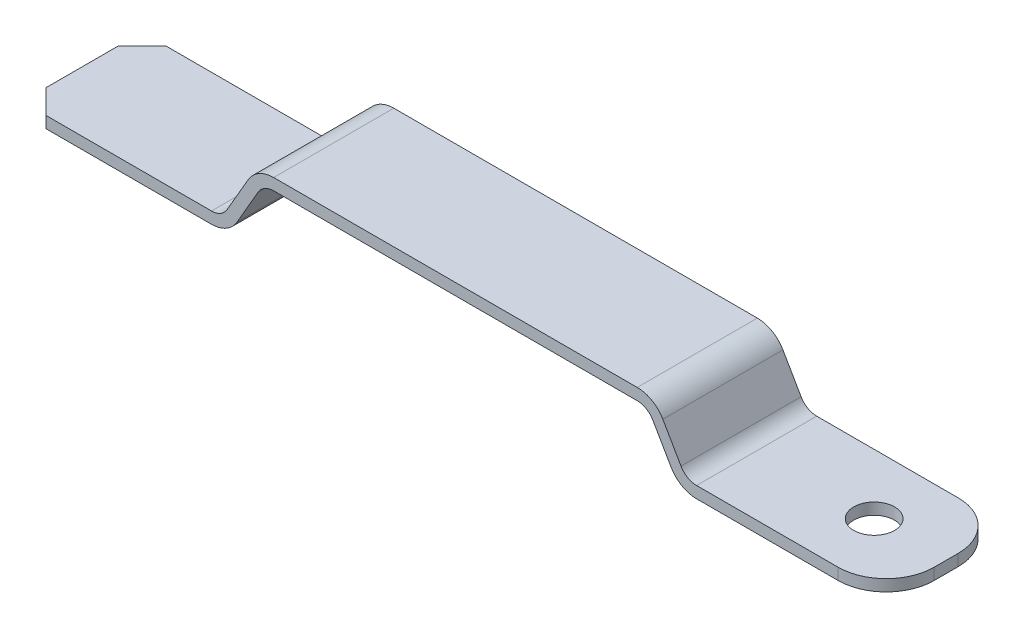
ISO-10303-21;
HEADER;
FILE_DESCRIPTION(('STEP AP214'),'2;1');
FILE_NAME('part.step','',(''),(''),'','','');
FILE_SCHEMA(('AUTOMOTIVE_DESIGN { 1 0 10303 214 1 1 1 1 }'));
ENDSEC;
DATA;
#1=APPLICATION_CONTEXT('core data for automotive mechanical design processes');
#2=APPLICATION_PROTOCOL_DEFINITION('international standard','automotive_design',2000,#1);
#3=PRODUCT_CONTEXT('',#1,'mechanical');
#4=PRODUCT('Part','Part','',(#3));
#5=PRODUCT_RELATED_PRODUCT_CATEGORY('part','',(#4));
#6=PRODUCT_DEFINITION_FORMATION('','',#4);
#7=PRODUCT_DEFINITION_CONTEXT('part definition',#1,'design');
#8=PRODUCT_DEFINITION('design','',#6,#7);
#9=PRODUCT_DEFINITION_SHAPE('','',#8);
#10=(LENGTH_UNIT() NAMED_UNIT(*) SI_UNIT(.MILLI.,.METRE.));
#11=(NAMED_UNIT(*) PLANE_ANGLE_UNIT() SI_UNIT($,.RADIAN.));
#12=(NAMED_UNIT(*) SI_UNIT($,.STERADIAN.) SOLID_ANGLE_UNIT());
#13=UNCERTAINTY_MEASURE_WITH_UNIT(LENGTH_MEASURE(1.E-05),#10,'distance_accuracy_value','');
#14=(GEOMETRIC_REPRESENTATION_CONTEXT(3) GLOBAL_UNCERTAINTY_ASSIGNED_CONTEXT((#13)) GLOBAL_UNIT_ASSIGNED_CONTEXT((#10,
#11,#12)) REPRESENTATION_CONTEXT('',''));
#15=CARTESIAN_POINT('',(0.,0.,0.));
#16=DIRECTION('',(0.,0.,1.));
#17=DIRECTION('',(1.,0.,0.));
#18=AXIS2_PLACEMENT_3D('',#15,#16,#17);
#19=CARTESIAN_POINT('',(-25.7899319203563,-5.13079999999999,6.34999999999999));
#20=DIRECTION('',(0.,-1.,0.));
#21=DIRECTION('',(0.999999999999999,0.,0.));
#22=AXIS2_PLACEMENT_3D('',#19,#20,#21);
#23=PLANE('',#22);
#24=DIRECTION('',(0.,0.,-0.999999999999999));
#25=VECTOR('',#24,1.);
#26=CARTESIAN_POINT('',(-45.8301742093541,-5.13080000000001,6.35));
#27=LINE('',#26,#25);
#28=CARTESIAN_POINT('',(-45.8301742093541,-5.13080000000001,3.80999999999999));
#29=VERTEX_POINT('',#28);
#30=CARTESIAN_POINT('',(-45.8301742093541,-5.13080000000001,-3.80999999999998));
#31=VERTEX_POINT('',#30);
#32=EDGE_CURVE('E356',#29,#31,#27,.T.);
#33=ORIENTED_EDGE('',*,*,#32,.F.);
#34=DIRECTION('',(0.707106781186546,0.,0.707106781186546));
#35=VECTOR('',#34,1.);
#36=CARTESIAN_POINT('',(-45.8301742093541,-5.13080000000001,3.80999999999999));
#37=LINE('',#36,#35);
#38=CARTESIAN_POINT('',(-43.2901742093541,-5.1308,6.35));
#39=VERTEX_POINT('',#38);
#40=EDGE_CURVE('E384',#29,#39,#37,.T.);
#41=ORIENTED_EDGE('',*,*,#40,.T.);
#42=DIRECTION('',(-0.999999999999999,0.,0.));
#43=VECTOR('',#42,1.);
#44=CARTESIAN_POINT('',(-25.7899319203563,-5.13079999999999,6.34999999999999));
#45=LINE('',#44,#43);
#46=CARTESIAN_POINT('',(-25.7899319203563,-5.13079999999999,6.34999999999999));
#47=VERTEX_POINT('',#46);
#48=EDGE_CURVE('E227',#47,#39,#45,.T.);
#49=ORIENTED_EDGE('',*,*,#48,.F.);
#50=DIRECTION('',(0.,0.,-0.999999999999999));
#51=VECTOR('',#50,1.);
#52=CARTESIAN_POINT('',(-25.7899319203563,-5.13079999999999,6.34999999999999));
#53=LINE('',#52,#51);
#54=CARTESIAN_POINT('',(-25.7899319203563,-5.13080000000001,-6.34999999999999));
#55=VERTEX_POINT('',#54);
#56=EDGE_CURVE('E268',#47,#55,#53,.T.);
#57=ORIENTED_EDGE('',*,*,#56,.T.);
#58=DIRECTION('',(-0.999999999999999,0.,0.));
#59=VECTOR('',#58,1.);
#60=CARTESIAN_POINT('',(-25.7899319203563,-5.13080000000001,-6.34999999999999));
#61=LINE('',#60,#59);
#62=CARTESIAN_POINT('',(-43.2901742093541,-5.13080000000001,-6.34999999999999));
#63=VERTEX_POINT('',#62);
#64=EDGE_CURVE('E269',#55,#63,#61,.T.);
#65=ORIENTED_EDGE('',*,*,#64,.T.);
#66=DIRECTION('',(0.707106781186545,0.,-0.707106781186548));
#67=VECTOR('',#66,1.);
#68=CARTESIAN_POINT('',(-43.2901742093541,-5.13080000000001,-6.34999999999999));
#69=LINE('',#68,#67);
#70=EDGE_CURVE('E382',#63,#31,#69,.F.);
#71=ORIENTED_EDGE('',*,*,#70,.T.);
#72=EDGE_LOOP('',(#33,#41,#49,#57,#65,#71));
#73=FACE_BOUND('',#72,.T.);
#74=ADVANCED_FACE('F48',(#73),#23,.F.);
#75=CARTESIAN_POINT('',(-45.8301742093541,-6.35000000000001,6.34999999999999));
#76=DIRECTION('',(-0.999999999999999,0.,0.));
#77=DIRECTION('',(0.,0.,0.999999999999999));
#78=AXIS2_PLACEMENT_3D('',#75,#76,#77);
#79=PLANE('',#78);
#80=DIRECTION('',(0.,0.,-0.999999999999999));
#81=VECTOR('',#80,1.);
#82=CARTESIAN_POINT('',(-45.8301742093541,-6.35000000000001,6.34999999999999));
#83=LINE('',#82,#81);
#84=CARTESIAN_POINT('',(-45.8301742093541,-6.35000000000001,3.80999999999999));
#85=VERTEX_POINT('',#84);
#86=CARTESIAN_POINT('',(-45.8301742093541,-6.35000000000001,-3.80999999999998));
#87=VERTEX_POINT('',#86);
#88=EDGE_CURVE('E219',#85,#87,#83,.T.);
#89=ORIENTED_EDGE('',*,*,#88,.F.);
#90=DIRECTION('',(0.,1.,0.));
#91=VECTOR('',#90,1.);
#92=CARTESIAN_POINT('',(-45.8301742093541,-5.13080000000001,3.80999999999999));
#93=LINE('',#92,#91);
#94=EDGE_CURVE('E379',#85,#29,#93,.T.);
#95=ORIENTED_EDGE('',*,*,#94,.T.);
#96=ORIENTED_EDGE('',*,*,#32,.T.);
#97=DIRECTION('',(0.,-1.,0.));
#98=VECTOR('',#97,1.);
#99=CARTESIAN_POINT('',(-45.8301742093541,-6.35000000000001,-3.80999999999998));
#100=LINE('',#99,#98);
#101=EDGE_CURVE('E377',#31,#87,#100,.T.);
#102=ORIENTED_EDGE('',*,*,#101,.T.);
#103=EDGE_LOOP('',(#89,#95,#96,#102));
#104=FACE_BOUND('',#103,.T.);
#105=ADVANCED_FACE('F391',(#104),#79,.T.);
#106=CARTESIAN_POINT('',(-25.7899319203563,-6.34999999999999,6.34999999999999));
#107=DIRECTION('',(0.,-1.,0.));
#108=DIRECTION('',(0.999999999999999,0.,0.));
#109=AXIS2_PLACEMENT_3D('',#106,#107,#108);
#110=PLANE('',#109);
#111=DIRECTION('',(-0.999999999999999,0.,0.));
#112=VECTOR('',#111,1.);
#113=CARTESIAN_POINT('',(-25.7899319203563,-6.34999999999999,6.34999999999999));
#114=LINE('',#113,#112);
#115=CARTESIAN_POINT('',(-25.7899319203563,-6.35000000000001,6.34999999999999));
#116=VERTEX_POINT('',#115);
#117=CARTESIAN_POINT('',(-43.2901742093541,-6.35,6.34999999999999));
#118=VERTEX_POINT('',#117);
#119=EDGE_CURVE('E212',#116,#118,#114,.T.);
#120=ORIENTED_EDGE('',*,*,#119,.T.);
#121=DIRECTION('',(-0.707106781186546,0.,-0.707106781186546));
#122=VECTOR('',#121,1.);
#123=CARTESIAN_POINT('',(-34.5400530648552,-6.35,15.1001211444989));
#124=LINE('',#123,#122);
#125=EDGE_CURVE('E56',#118,#85,#124,.T.);
#126=ORIENTED_EDGE('',*,*,#125,.T.);
#127=ORIENTED_EDGE('',*,*,#88,.T.);
#128=DIRECTION('',(-0.707106781186545,0.,0.707106781186548));
#129=VECTOR('',#128,1.);
#130=CARTESIAN_POINT('',(-40.8900530648553,-6.35000000000001,-8.75012114449885));
#131=LINE('',#130,#129);
#132=CARTESIAN_POINT('',(-43.2901742093541,-6.35000000000002,-6.34999999999999));
#133=VERTEX_POINT('',#132);
#134=EDGE_CURVE('E63',#87,#133,#131,.F.);
#135=ORIENTED_EDGE('',*,*,#134,.T.);
#136=DIRECTION('',(-0.999999999999999,0.,0.));
#137=VECTOR('',#136,1.);
#138=CARTESIAN_POINT('',(-25.7899319203563,-6.35,-6.34999999999999));
#139=LINE('',#138,#137);
#140=CARTESIAN_POINT('',(-25.7899319203563,-6.35000000000002,-6.34999999999999));
#141=VERTEX_POINT('',#140);
#142=EDGE_CURVE('E214',#141,#133,#139,.T.);
#143=ORIENTED_EDGE('',*,*,#142,.F.);
#144=DIRECTION('',(0.,0.,-0.999999999999999));
#145=VECTOR('',#144,1.);
#146=CARTESIAN_POINT('',(-25.7899319203563,-6.35000000000001,6.34999999999999));
#147=LINE('',#146,#145);
#148=EDGE_CURVE('E210',#116,#141,#147,.T.);
#149=ORIENTED_EDGE('',*,*,#148,.F.);
#150=EDGE_LOOP('',(#120,#126,#127,#135,#143,#149));
#151=FACE_BOUND('',#150,.T.);
#152=ADVANCED_FACE('F211',(#151),#110,.T.);
#153=CARTESIAN_POINT('',(-25.7899319203564,-3.22579999999999,6.35));
#154=DIRECTION('',(0.,0.,-0.999999999999999));
#155=DIRECTION('',(-0.999999999999999,0.,0.));
#156=AXIS2_PLACEMENT_3D('',#153,#154,#155);
#157=CYLINDRICAL_SURFACE('',#156,3.12420000000001);
#158=CARTESIAN_POINT('',(-25.7899319203564,-3.2258,-6.34999999999999));
#159=DIRECTION('',(0.,0.,-0.999999999999999));
#160=DIRECTION('',(-0.999999999999999,0.,0.));
#161=AXIS2_PLACEMENT_3D('',#158,#159,#160);
#162=CIRCLE('',#161,3.12420000000001);
#163=CARTESIAN_POINT('',(-23.084295353853,-4.78790000000001,-6.34999999999999));
#164=VERTEX_POINT('',#163);
#165=EDGE_CURVE('E274',#164,#141,#162,.T.);
#166=ORIENTED_EDGE('',*,*,#165,.F.);
#167=DIRECTION('',(0.,0.,-0.999999999999999));
#168=VECTOR('',#167,1.);
#169=CARTESIAN_POINT('',(-23.084295353853,-4.7879,6.34999999999999));
#170=LINE('',#169,#168);
#171=CARTESIAN_POINT('',(-23.084295353853,-4.7879,6.34999999999999));
#172=VERTEX_POINT('',#171);
#173=EDGE_CURVE('E220',#172,#164,#170,.T.);
#174=ORIENTED_EDGE('',*,*,#173,.F.);
#175=CARTESIAN_POINT('',(-25.7899319203564,-3.22579999999999,6.35));
#176=DIRECTION('',(0.,0.,-0.999999999999999));
#177=DIRECTION('',(-0.999999999999999,0.,0.));
#178=AXIS2_PLACEMENT_3D('',#175,#176,#177);
#179=CIRCLE('',#178,3.12420000000001);
#180=EDGE_CURVE('E225',#172,#116,#179,.T.);
#181=ORIENTED_EDGE('',*,*,#180,.T.);
#182=ORIENTED_EDGE('',*,*,#148,.T.);
#183=EDGE_LOOP('',(#166,#174,#181,#182));
#184=FACE_BOUND('',#183,.T.);
#185=ADVANCED_FACE('F229',(#184),#157,.T.);
#186=CARTESIAN_POINT('',(-20.8699261314031,-0.952500000000002,6.34999999999999));
#187=DIRECTION('',(0.866025403784437,-0.5,0.));
#188=DIRECTION('',(0.5,0.866025403784439,0.));
#189=AXIS2_PLACEMENT_3D('',#186,#187,#188);
#190=PLANE('',#189);
#191=DIRECTION('',(-0.5,-0.866025403784438,0.));
#192=VECTOR('',#191,1.);
#193=CARTESIAN_POINT('',(-20.8699261314031,-0.952500000000002,-6.34999999999999));
#194=LINE('',#193,#192);
#195=CARTESIAN_POINT('',(-20.8699261314031,-0.952500000000002,-6.34999999999999));
#196=VERTEX_POINT('',#195);
#197=EDGE_CURVE('E276',#196,#164,#194,.T.);
#198=ORIENTED_EDGE('',*,*,#197,.F.);
#199=DIRECTION('',(0.,0.,-0.999999999999999));
#200=VECTOR('',#199,1.);
#201=CARTESIAN_POINT('',(-20.8699261314031,-0.952500000000002,6.34999999999999));
#202=LINE('',#201,#200);
#203=CARTESIAN_POINT('',(-20.8699261314031,-0.952500000000002,6.34999999999999));
#204=VERTEX_POINT('',#203);
#205=EDGE_CURVE('E352',#204,#196,#202,.T.);
#206=ORIENTED_EDGE('',*,*,#205,.F.);
#207=DIRECTION('',(-0.5,-0.866025403784438,0.));
#208=VECTOR('',#207,1.);
#209=CARTESIAN_POINT('',(-20.8699261314031,-0.952500000000002,6.34999999999999));
#210=LINE('',#209,#208);
#211=EDGE_CURVE('E230',#204,#172,#210,.T.);
#212=ORIENTED_EDGE('',*,*,#211,.T.);
#213=ORIENTED_EDGE('',*,*,#173,.T.);
#214=EDGE_LOOP('',(#198,#206,#212,#213));
#215=FACE_BOUND('',#214,.T.);
#216=ADVANCED_FACE('F456',(#215),#190,.T.);
#217=CARTESIAN_POINT('',(-19.2201477371938,-1.90500000000001,6.34999999999999));
#218=DIRECTION('',(0.,0.,-0.999999999999999));
#219=DIRECTION('',(-0.999999999999999,0.,0.));
#220=AXIS2_PLACEMENT_3D('',#217,#218,#219);
#221=CYLINDRICAL_SURFACE('',#220,1.905);
#222=CARTESIAN_POINT('',(-19.2201477371938,-1.905,-6.34999999999999));
#223=DIRECTION('',(0.,0.,0.999999999999999));
#224=DIRECTION('',(0.999999999999999,0.,0.));
#225=AXIS2_PLACEMENT_3D('',#222,#223,#224);
#226=CIRCLE('',#225,1.905);
#227=CARTESIAN_POINT('',(-19.2201477371938,0.,-6.34999999999999));
#228=VERTEX_POINT('',#227);
#229=EDGE_CURVE('E279',#228,#196,#226,.T.);
#230=ORIENTED_EDGE('',*,*,#229,.F.);
#231=DIRECTION('',(0.,0.,-0.999999999999999));
#232=VECTOR('',#231,1.);
#233=CARTESIAN_POINT('',(-19.2201477371938,0.,6.34999999999999));
#234=LINE('',#233,#232);
#235=CARTESIAN_POINT('',(-19.2201477371938,0.,6.34999999999999));
#236=VERTEX_POINT('',#235);
#237=EDGE_CURVE('E350',#236,#228,#234,.T.);
#238=ORIENTED_EDGE('',*,*,#237,.F.);
#239=CARTESIAN_POINT('',(-19.2201477371938,-1.90500000000001,6.34999999999999));
#240=DIRECTION('',(0.,0.,0.999999999999999));
#241=DIRECTION('',(0.999999999999999,0.,0.));
#242=AXIS2_PLACEMENT_3D('',#239,#240,#241);
#243=CIRCLE('',#242,1.905);
#244=EDGE_CURVE('E232',#236,#204,#243,.T.);
#245=ORIENTED_EDGE('',*,*,#244,.T.);
#246=ORIENTED_EDGE('',*,*,#205,.T.);
#247=EDGE_LOOP('',(#230,#238,#245,#246));
#248=FACE_BOUND('',#247,.T.);
#249=ADVANCED_FACE('F453',(#248),#221,.F.);
#250=CARTESIAN_POINT('',(-19.2201477371938,0.,6.34999999999999));
#251=DIRECTION('',(0.,-1.,0.));
#252=DIRECTION('',(0.,0.,-0.999999999999999));
#253=AXIS2_PLACEMENT_3D('',#250,#251,#252);
#254=PLANE('',#253);
#255=DIRECTION('',(-0.999999999999999,0.,0.));
#256=VECTOR('',#255,1.);
#257=CARTESIAN_POINT('',(-19.2201477371938,0.,-6.34999999999999));
#258=LINE('',#257,#256);
#259=CARTESIAN_POINT('',(19.2201477371937,0.,-6.34999999999999));
#260=VERTEX_POINT('',#259);
#261=EDGE_CURVE('E282',#260,#228,#258,.T.);
#262=ORIENTED_EDGE('',*,*,#261,.F.);
#263=DIRECTION('',(0.,0.,-0.999999999999999));
#264=VECTOR('',#263,1.);
#265=CARTESIAN_POINT('',(19.2201477371937,0.,6.34999999999999));
#266=LINE('',#265,#264);
#267=CARTESIAN_POINT('',(19.2201477371937,0.,6.34999999999999));
#268=VERTEX_POINT('',#267);
#269=EDGE_CURVE('E348',#268,#260,#266,.T.);
#270=ORIENTED_EDGE('',*,*,#269,.F.);
#271=DIRECTION('',(-0.999999999999999,0.,0.));
#272=VECTOR('',#271,1.);
#273=CARTESIAN_POINT('',(-19.2201477371938,0.,6.34999999999999));
#274=LINE('',#273,#272);
#275=EDGE_CURVE('E238',#268,#236,#274,.T.);
#276=ORIENTED_EDGE('',*,*,#275,.T.);
#277=ORIENTED_EDGE('',*,*,#237,.T.);
#278=EDGE_LOOP('',(#262,#270,#276,#277));
#279=FACE_BOUND('',#278,.T.);
#280=ADVANCED_FACE('F449',(#279),#254,.T.);
#281=CARTESIAN_POINT('',(19.2201477371937,-1.905,6.34999999999999));
#282=DIRECTION('',(0.,0.,-0.999999999999999));
#283=DIRECTION('',(-0.999999999999999,0.,0.));
#284=AXIS2_PLACEMENT_3D('',#281,#282,#283);
#285=CYLINDRICAL_SURFACE('',#284,1.905);
#286=CARTESIAN_POINT('',(19.2201477371937,-1.905,-6.34999999999999));
#287=DIRECTION('',(0.,0.,0.999999999999999));
#288=DIRECTION('',(-0.999999999999999,0.,0.));
#289=AXIS2_PLACEMENT_3D('',#286,#287,#288);
#290=CIRCLE('',#289,1.905);
#291=CARTESIAN_POINT('',(20.8699261314031,-0.952499999999995,-6.34999999999999));
#292=VERTEX_POINT('',#291);
#293=EDGE_CURVE('E285',#292,#260,#290,.T.);
#294=ORIENTED_EDGE('',*,*,#293,.F.);
#295=DIRECTION('',(0.,0.,-0.999999999999999));
#296=VECTOR('',#295,1.);
#297=CARTESIAN_POINT('',(20.8699261314031,-0.952500000000002,6.34999999999999));
#298=LINE('',#297,#296);
#299=CARTESIAN_POINT('',(20.8699261314031,-0.952500000000002,6.34999999999999));
#300=VERTEX_POINT('',#299);
#301=EDGE_CURVE('E346',#300,#292,#298,.T.);
#302=ORIENTED_EDGE('',*,*,#301,.F.);
#303=CARTESIAN_POINT('',(19.2201477371937,-1.905,6.34999999999999));
#304=DIRECTION('',(0.,0.,0.999999999999999));
#305=DIRECTION('',(-0.999999999999999,0.,0.));
#306=AXIS2_PLACEMENT_3D('',#303,#304,#305);
#307=CIRCLE('',#306,1.905);
#308=EDGE_CURVE('E241',#300,#268,#307,.T.);
#309=ORIENTED_EDGE('',*,*,#308,.T.);
#310=ORIENTED_EDGE('',*,*,#269,.T.);
#311=EDGE_LOOP('',(#294,#302,#309,#310));
#312=FACE_BOUND('',#311,.T.);
#313=ADVANCED_FACE('F445',(#312),#285,.F.);
#314=CARTESIAN_POINT('',(20.8699261314031,-0.952500000000002,6.34999999999999));
#315=DIRECTION('',(-0.866025403784437,-0.5,0.));
#316=DIRECTION('',(0.499999999999999,-0.866025403784439,0.));
#317=AXIS2_PLACEMENT_3D('',#314,#315,#316);
#318=PLANE('',#317);
#319=DIRECTION('',(-0.499999999999999,0.866025403784439,0.));
#320=VECTOR('',#319,1.);
#321=CARTESIAN_POINT('',(20.8699261314031,-0.952499999999995,-6.34999999999999));
#322=LINE('',#321,#320);
#323=CARTESIAN_POINT('',(22.7910014171046,-4.27990000000001,-6.34999999999999));
#324=VERTEX_POINT('',#323);
#325=EDGE_CURVE('E288',#324,#292,#322,.T.);
#326=ORIENTED_EDGE('',*,*,#325,.F.);
#327=DIRECTION('',(0.,0.,-0.999999999999999));
#328=VECTOR('',#327,1.);
#329=CARTESIAN_POINT('',(22.7910014171046,-4.2799,6.34999999999999));
#330=LINE('',#329,#328);
#331=CARTESIAN_POINT('',(22.7910014171046,-4.2799,6.34999999999999));
#332=VERTEX_POINT('',#331);
#333=EDGE_CURVE('E344',#332,#324,#330,.T.);
#334=ORIENTED_EDGE('',*,*,#333,.F.);
#335=DIRECTION('',(-0.499999999999999,0.866025403784439,0.));
#336=VECTOR('',#335,1.);
#337=CARTESIAN_POINT('',(20.8699261314031,-0.952500000000002,6.34999999999999));
#338=LINE('',#337,#336);
#339=EDGE_CURVE('E244',#332,#300,#338,.T.);
#340=ORIENTED_EDGE('',*,*,#339,.T.);
#341=ORIENTED_EDGE('',*,*,#301,.T.);
#342=EDGE_LOOP('',(#326,#334,#340,#341));
#343=FACE_BOUND('',#342,.T.);
#344=ADVANCED_FACE('F441',(#343),#318,.T.);
#345=CARTESIAN_POINT('',(25.4966379836079,-2.71780000000001,6.34999999999999));
#346=DIRECTION('',(0.,0.,-0.999999999999999));
#347=DIRECTION('',(-0.999999999999999,0.,0.));
#348=AXIS2_PLACEMENT_3D('',#345,#346,#347);
#349=CYLINDRICAL_SURFACE('',#348,3.12419999999999);
#350=CARTESIAN_POINT('',(25.4966379836079,-2.71780000000001,-6.34999999999999));
#351=DIRECTION('',(0.,0.,-0.999999999999999));
#352=DIRECTION('',(0.999999999999999,0.,0.));
#353=AXIS2_PLACEMENT_3D('',#350,#351,#352);
#354=CIRCLE('',#353,3.12419999999999);
#355=CARTESIAN_POINT('',(25.496637983608,-5.84200000000001,-6.34999999999999));
#356=VERTEX_POINT('',#355);
#357=EDGE_CURVE('E291',#356,#324,#354,.T.);
#358=ORIENTED_EDGE('',*,*,#357,.F.);
#359=DIRECTION('',(0.,0.,-0.999999999999999));
#360=VECTOR('',#359,1.);
#361=CARTESIAN_POINT('',(25.496637983608,-5.842,6.34999999999999));
#362=LINE('',#361,#360);
#363=CARTESIAN_POINT('',(25.496637983608,-5.842,6.34999999999999));
#364=VERTEX_POINT('',#363);
#365=EDGE_CURVE('E341',#364,#356,#362,.T.);
#366=ORIENTED_EDGE('',*,*,#365,.F.);
#367=CARTESIAN_POINT('',(25.4966379836079,-2.71780000000001,6.34999999999999));
#368=DIRECTION('',(0.,0.,-0.999999999999999));
#369=DIRECTION('',(0.999999999999999,0.,0.));
#370=AXIS2_PLACEMENT_3D('',#367,#368,#369);
#371=CIRCLE('',#370,3.12419999999999);
#372=EDGE_CURVE('E247',#364,#332,#371,.T.);
#373=ORIENTED_EDGE('',*,*,#372,.T.);
#374=ORIENTED_EDGE('',*,*,#333,.T.);
#375=EDGE_LOOP('',(#358,#366,#373,#374));
#376=FACE_BOUND('',#375,.T.);
#377=ADVANCED_FACE('F437',(#376),#349,.T.);
#378=CARTESIAN_POINT('',(25.496637983608,-5.842,6.34999999999999));
#379=DIRECTION('',(0.,-1.,0.));
#380=DIRECTION('',(0.,0.,-0.999999999999999));
#381=AXIS2_PLACEMENT_3D('',#378,#379,#380);
#382=PLANE('',#381);
#383=CARTESIAN_POINT('',(37.9168802726057,-5.842,0.));
#384=DIRECTION('',(0.,-1.,0.));
#385=DIRECTION('',(0.,0.,-0.999999999999999));
#386=AXIS2_PLACEMENT_3D('',#383,#384,#385);
#387=CIRCLE('',#386,2.159);
#388=CARTESIAN_POINT('',(37.9168802726057,-5.842,2.159));
#389=VERTEX_POINT('',#388);
#390=EDGE_CURVE('E272',#389,#389,#387,.T.);
#391=ORIENTED_EDGE('',*,*,#390,.F.);
#392=EDGE_LOOP('',(#391));
#393=FACE_BOUND('',#392,.T.);
#394=DIRECTION('',(-0.999999999999999,0.,0.));
#395=VECTOR('',#394,1.);
#396=CARTESIAN_POINT('',(25.496637983608,-5.84200000000001,-6.34999999999999));
#397=LINE('',#396,#395);
#398=CARTESIAN_POINT('',(40.4568802726057,-5.84200000000001,-6.34999999999999));
#399=VERTEX_POINT('',#398);
#400=EDGE_CURVE('E294',#399,#356,#397,.T.);
#401=ORIENTED_EDGE('',*,*,#400,.F.);
#402=CARTESIAN_POINT('',(40.4568802726057,-5.84200000000001,-1.27));
#403=DIRECTION('',(0.,-1.,0.));
#404=DIRECTION('',(0.,0.,-0.999999999999999));
#405=AXIS2_PLACEMENT_3D('',#402,#403,#404);
#406=CIRCLE('',#405,5.08);
#407=CARTESIAN_POINT('',(45.5368802726057,-5.842,-1.27));
#408=VERTEX_POINT('',#407);
#409=EDGE_CURVE('E364',#399,#408,#406,.T.);
#410=ORIENTED_EDGE('',*,*,#409,.T.);
#411=DIRECTION('',(0.,0.,-0.999999999999999));
#412=VECTOR('',#411,1.);
#413=CARTESIAN_POINT('',(45.5368802726057,-5.84199999999999,6.35));
#414=LINE('',#413,#412);
#415=CARTESIAN_POINT('',(45.5368802726057,-5.84199999999999,1.27));
#416=VERTEX_POINT('',#415);
#417=EDGE_CURVE('E338',#416,#408,#414,.T.);
#418=ORIENTED_EDGE('',*,*,#417,.F.);
#419=CARTESIAN_POINT('',(40.4568802726057,-5.84200000000001,1.27));
#420=DIRECTION('',(0.,-1.,0.));
#421=DIRECTION('',(0.,0.,-0.999999999999999));
#422=AXIS2_PLACEMENT_3D('',#419,#420,#421);
#423=CIRCLE('',#422,5.08);
#424=CARTESIAN_POINT('',(40.4568802726057,-5.842,6.34999999999999));
#425=VERTEX_POINT('',#424);
#426=EDGE_CURVE('E362',#416,#425,#423,.T.);
#427=ORIENTED_EDGE('',*,*,#426,.T.);
#428=DIRECTION('',(-0.999999999999999,0.,0.));
#429=VECTOR('',#428,1.);
#430=CARTESIAN_POINT('',(25.496637983608,-5.842,6.34999999999999));
#431=LINE('',#430,#429);
#432=EDGE_CURVE('E250',#425,#364,#431,.T.);
#433=ORIENTED_EDGE('',*,*,#432,.T.);
#434=ORIENTED_EDGE('',*,*,#365,.T.);
#435=EDGE_LOOP('',(#401,#410,#418,#427,#433,#434));
#436=FACE_BOUND('',#435,.T.);
#437=ADVANCED_FACE('F430',(#393,#436),#382,.T.);
#438=CARTESIAN_POINT('',(45.5368802726057,-4.62279999999999,6.35));
#439=DIRECTION('',(0.999999999999999,0.,0.));
#440=DIRECTION('',(0.,0.,-0.999999999999999));
#441=AXIS2_PLACEMENT_3D('',#438,#439,#440);
#442=PLANE('',#441);
#443=ORIENTED_EDGE('',*,*,#417,.T.);
#444=DIRECTION('',(0.,-1.,0.));
#445=VECTOR('',#444,1.);
#446=CARTESIAN_POINT('',(45.5368802726057,-4.6228,-1.27));
#447=LINE('',#446,#445);
#448=CARTESIAN_POINT('',(45.5368802726057,-4.6228,-1.27));
#449=VERTEX_POINT('',#448);
#450=EDGE_CURVE('E369',#408,#449,#447,.F.);
#451=ORIENTED_EDGE('',*,*,#450,.T.);
#452=DIRECTION('',(0.,0.,-0.999999999999999));
#453=VECTOR('',#452,1.);
#454=CARTESIAN_POINT('',(45.5368802726057,-4.62279999999999,6.35));
#455=LINE('',#454,#453);
#456=CARTESIAN_POINT('',(45.5368802726057,-4.62279999999999,1.27));
#457=VERTEX_POINT('',#456);
#458=EDGE_CURVE('E335',#457,#449,#455,.T.);
#459=ORIENTED_EDGE('',*,*,#458,.F.);
#460=DIRECTION('',(0.,-1.,0.));
#461=VECTOR('',#460,1.);
#462=CARTESIAN_POINT('',(45.5368802726057,-5.84199999999999,1.27));
#463=LINE('',#462,#461);
#464=EDGE_CURVE('E366',#457,#416,#463,.T.);
#465=ORIENTED_EDGE('',*,*,#464,.T.);
#466=EDGE_LOOP('',(#443,#451,#459,#465));
#467=FACE_BOUND('',#466,.T.);
#468=ADVANCED_FACE('F412',(#467),#442,.T.);
#469=CARTESIAN_POINT('',(25.496637983608,-4.6228,6.35));
#470=DIRECTION('',(0.,-1.,0.));
#471=DIRECTION('',(0.,0.,-0.999999999999999));
#472=AXIS2_PLACEMENT_3D('',#469,#470,#471);
#473=PLANE('',#472);
#474=CARTESIAN_POINT('',(37.9168802726057,-4.6228,0.));
#475=DIRECTION('',(0.,1.,0.));
#476=DIRECTION('',(0.,0.,0.999999999999999));
#477=AXIS2_PLACEMENT_3D('',#474,#475,#476);
#478=CIRCLE('',#477,2.159);
#479=CARTESIAN_POINT('',(37.9168802726057,-4.6228,2.159));
#480=VERTEX_POINT('',#479);
#481=EDGE_CURVE('E402',#480,#480,#478,.T.);
#482=ORIENTED_EDGE('',*,*,#481,.F.);
#483=EDGE_LOOP('',(#482));
#484=FACE_BOUND('',#483,.T.);
#485=ORIENTED_EDGE('',*,*,#458,.T.);
#486=CARTESIAN_POINT('',(40.4568802726057,-4.6228,-1.27));
#487=DIRECTION('',(0.,-1.,0.));
#488=DIRECTION('',(0.,0.,-0.999999999999999));
#489=AXIS2_PLACEMENT_3D('',#486,#487,#488);
#490=CIRCLE('',#489,5.08);
#491=CARTESIAN_POINT('',(40.4568802726057,-4.6228,-6.34999999999999));
#492=VERTEX_POINT('',#491);
#493=EDGE_CURVE('E373',#449,#492,#490,.F.);
#494=ORIENTED_EDGE('',*,*,#493,.T.);
#495=DIRECTION('',(0.999999999999999,0.,0.));
#496=VECTOR('',#495,1.);
#497=CARTESIAN_POINT('',(25.496637983608,-4.62280000000001,-6.34999999999999));
#498=LINE('',#497,#496);
#499=CARTESIAN_POINT('',(25.496637983608,-4.6228,-6.34999999999999));
#500=VERTEX_POINT('',#499);
#501=EDGE_CURVE('E296',#492,#500,#498,.F.);
#502=ORIENTED_EDGE('',*,*,#501,.T.);
#503=DIRECTION('',(0.,0.,-0.999999999999999));
#504=VECTOR('',#503,1.);
#505=CARTESIAN_POINT('',(25.496637983608,-4.62279999999999,6.35));
#506=LINE('',#505,#504);
#507=CARTESIAN_POINT('',(25.496637983608,-4.62279999999999,6.35));
#508=VERTEX_POINT('',#507);
#509=EDGE_CURVE('E332',#508,#500,#506,.T.);
#510=ORIENTED_EDGE('',*,*,#509,.F.);
#511=DIRECTION('',(0.999999999999999,0.,0.));
#512=VECTOR('',#511,1.);
#513=CARTESIAN_POINT('',(25.496637983608,-4.6228,6.35));
#514=LINE('',#513,#512);
#515=CARTESIAN_POINT('',(40.4568802726057,-4.6228,6.34999999999999));
#516=VERTEX_POINT('',#515);
#517=EDGE_CURVE('E252',#516,#508,#514,.F.);
#518=ORIENTED_EDGE('',*,*,#517,.F.);
#519=CARTESIAN_POINT('',(40.4568802726057,-4.6228,1.27));
#520=DIRECTION('',(0.,-1.,0.));
#521=DIRECTION('',(0.,0.,-0.999999999999999));
#522=AXIS2_PLACEMENT_3D('',#519,#520,#521);
#523=CIRCLE('',#522,5.08);
#524=EDGE_CURVE('E371',#516,#457,#523,.F.);
#525=ORIENTED_EDGE('',*,*,#524,.T.);
#526=EDGE_LOOP('',(#485,#494,#502,#510,#518,#525));
#527=FACE_BOUND('',#526,.T.);
#528=ADVANCED_FACE('F408',(#484,#527),#473,.F.);
#529=CARTESIAN_POINT('',(25.4966379836079,-2.71780000000001,6.34999999999999));
#530=DIRECTION('',(0.,0.,-0.999999999999999));
#531=DIRECTION('',(-0.999999999999999,0.,0.));
#532=AXIS2_PLACEMENT_3D('',#529,#530,#531);
#533=CYLINDRICAL_SURFACE('',#532,1.90499999999999);
#534=CARTESIAN_POINT('',(25.4966379836079,-2.71780000000001,-6.34999999999999));
#535=DIRECTION('',(0.,0.,0.999999999999999));
#536=DIRECTION('',(0.999999999999999,0.,0.));
#537=AXIS2_PLACEMENT_3D('',#534,#535,#536);
#538=CIRCLE('',#537,1.90499999999999);
#539=CARTESIAN_POINT('',(23.8468595893986,-3.67029999999999,-6.34999999999999));
#540=VERTEX_POINT('',#539);
#541=EDGE_CURVE('E298',#500,#540,#538,.F.);
#542=ORIENTED_EDGE('',*,*,#541,.T.);
#543=DIRECTION('',(0.,0.,-0.999999999999999));
#544=VECTOR('',#543,1.);
#545=CARTESIAN_POINT('',(23.8468595893986,-3.6703,6.34999999999999));
#546=LINE('',#545,#544);
#547=CARTESIAN_POINT('',(23.8468595893986,-3.6703,6.34999999999999));
#548=VERTEX_POINT('',#547);
#549=EDGE_CURVE('E329',#548,#540,#546,.T.);
#550=ORIENTED_EDGE('',*,*,#549,.F.);
#551=CARTESIAN_POINT('',(25.4966379836079,-2.71780000000001,6.34999999999999));
#552=DIRECTION('',(0.,0.,0.999999999999999));
#553=DIRECTION('',(0.999999999999999,0.,0.));
#554=AXIS2_PLACEMENT_3D('',#551,#552,#553);
#555=CIRCLE('',#554,1.90499999999999);
#556=EDGE_CURVE('E254',#508,#548,#555,.F.);
#557=ORIENTED_EDGE('',*,*,#556,.F.);
#558=ORIENTED_EDGE('',*,*,#509,.T.);
#559=EDGE_LOOP('',(#542,#550,#557,#558));
#560=FACE_BOUND('',#559,.T.);
#561=ADVANCED_FACE('F411',(#560),#533,.F.);
#562=CARTESIAN_POINT('',(21.9257843036971,-0.3429,6.34999999999999));
#563=DIRECTION('',(-0.866025403784437,-0.5,0.));
#564=DIRECTION('',(0.499999999999999,-0.866025403784439,0.));
#565=AXIS2_PLACEMENT_3D('',#562,#563,#564);
#566=PLANE('',#565);
#567=DIRECTION('',(-0.499999999999999,0.866025403784439,0.));
#568=VECTOR('',#567,1.);
#569=CARTESIAN_POINT('',(21.9257843036971,-0.3429,-6.34999999999999));
#570=LINE('',#569,#568);
#571=CARTESIAN_POINT('',(21.9257843036971,-0.3429,-6.34999999999999));
#572=VERTEX_POINT('',#571);
#573=EDGE_CURVE('E300',#540,#572,#570,.T.);
#574=ORIENTED_EDGE('',*,*,#573,.T.);
#575=DIRECTION('',(0.,0.,-0.999999999999999));
#576=VECTOR('',#575,1.);
#577=CARTESIAN_POINT('',(21.9257843036971,-0.342900000000007,6.34999999999999));
#578=LINE('',#577,#576);
#579=CARTESIAN_POINT('',(21.9257843036971,-0.342900000000007,6.34999999999999));
#580=VERTEX_POINT('',#579);
#581=EDGE_CURVE('E326',#580,#572,#578,.T.);
#582=ORIENTED_EDGE('',*,*,#581,.F.);
#583=DIRECTION('',(-0.499999999999999,0.866025403784439,0.));
#584=VECTOR('',#583,1.);
#585=CARTESIAN_POINT('',(21.9257843036971,-0.3429,6.34999999999999));
#586=LINE('',#585,#584);
#587=EDGE_CURVE('E256',#548,#580,#586,.T.);
#588=ORIENTED_EDGE('',*,*,#587,.F.);
#589=ORIENTED_EDGE('',*,*,#549,.T.);
#590=EDGE_LOOP('',(#574,#582,#588,#589));
#591=FACE_BOUND('',#590,.T.);
#592=ADVANCED_FACE('F487',(#591),#566,.F.);
#593=CARTESIAN_POINT('',(19.2201477371937,-1.905,6.34999999999999));
#594=DIRECTION('',(0.,0.,-0.999999999999999));
#595=DIRECTION('',(-0.999999999999999,0.,0.));
#596=AXIS2_PLACEMENT_3D('',#593,#594,#595);
#597=CYLINDRICAL_SURFACE('',#596,3.1242);
#598=CARTESIAN_POINT('',(19.2201477371937,-1.905,-6.34999999999999));
#599=DIRECTION('',(0.,0.,0.999999999999999));
#600=DIRECTION('',(0.999999999999999,0.,0.));
#601=AXIS2_PLACEMENT_3D('',#598,#599,#600);
#602=CIRCLE('',#601,3.1242);
#603=CARTESIAN_POINT('',(19.2201477371937,1.2192,-6.34999999999999));
#604=VERTEX_POINT('',#603);
#605=EDGE_CURVE('E302',#572,#604,#602,.T.);
#606=ORIENTED_EDGE('',*,*,#605,.T.);
#607=DIRECTION('',(0.,0.,-0.999999999999999));
#608=VECTOR('',#607,1.);
#609=CARTESIAN_POINT('',(19.2201477371937,1.2192,6.34999999999999));
#610=LINE('',#609,#608);
#611=CARTESIAN_POINT('',(19.2201477371937,1.2192,6.34999999999999));
#612=VERTEX_POINT('',#611);
#613=EDGE_CURVE('E323',#612,#604,#610,.T.);
#614=ORIENTED_EDGE('',*,*,#613,.F.);
#615=CARTESIAN_POINT('',(19.2201477371937,-1.905,6.34999999999999));
#616=DIRECTION('',(0.,0.,0.999999999999999));
#617=DIRECTION('',(0.999999999999999,0.,0.));
#618=AXIS2_PLACEMENT_3D('',#615,#616,#617);
#619=CIRCLE('',#618,3.1242);
#620=EDGE_CURVE('E258',#580,#612,#619,.T.);
#621=ORIENTED_EDGE('',*,*,#620,.F.);
#622=ORIENTED_EDGE('',*,*,#581,.T.);
#623=EDGE_LOOP('',(#606,#614,#621,#622));
#624=FACE_BOUND('',#623,.T.);
#625=ADVANCED_FACE('F483',(#624),#597,.T.);
#626=CARTESIAN_POINT('',(-19.2201477371937,1.21919999999999,6.34999999999999));
#627=DIRECTION('',(0.,-1.,0.));
#628=DIRECTION('',(0.,0.,-0.999999999999999));
#629=AXIS2_PLACEMENT_3D('',#626,#627,#628);
#630=PLANE('',#629);
#631=DIRECTION('',(0.999999999999999,0.,0.));
#632=VECTOR('',#631,1.);
#633=CARTESIAN_POINT('',(-19.2201477371937,1.2192,-6.34999999999999));
#634=LINE('',#633,#632);
#635=CARTESIAN_POINT('',(-19.2201477371937,1.21919999999999,-6.34999999999999));
#636=VERTEX_POINT('',#635);
#637=EDGE_CURVE('E304',#604,#636,#634,.F.);
#638=ORIENTED_EDGE('',*,*,#637,.T.);
#639=DIRECTION('',(0.,0.,-0.999999999999999));
#640=VECTOR('',#639,1.);
#641=CARTESIAN_POINT('',(-19.2201477371937,1.21919999999999,6.34999999999999));
#642=LINE('',#641,#640);
#643=CARTESIAN_POINT('',(-19.2201477371937,1.21919999999999,6.34999999999999));
#644=VERTEX_POINT('',#643);
#645=EDGE_CURVE('E320',#644,#636,#642,.T.);
#646=ORIENTED_EDGE('',*,*,#645,.F.);
#647=DIRECTION('',(0.999999999999999,0.,0.));
#648=VECTOR('',#647,1.);
#649=CARTESIAN_POINT('',(-19.2201477371937,1.21919999999999,6.34999999999999));
#650=LINE('',#649,#648);
#651=EDGE_CURVE('E260',#612,#644,#650,.F.);
#652=ORIENTED_EDGE('',*,*,#651,.F.);
#653=ORIENTED_EDGE('',*,*,#613,.T.);
#654=EDGE_LOOP('',(#638,#646,#652,#653));
#655=FACE_BOUND('',#654,.T.);
#656=ADVANCED_FACE('F478',(#655),#630,.F.);
#657=CARTESIAN_POINT('',(-19.2201477371938,-1.90500000000001,6.34999999999999));
#658=DIRECTION('',(0.,0.,-0.999999999999999));
#659=DIRECTION('',(-0.999999999999999,0.,0.));
#660=AXIS2_PLACEMENT_3D('',#657,#658,#659);
#661=CYLINDRICAL_SURFACE('',#660,3.1242);
#662=CARTESIAN_POINT('',(-19.2201477371938,-1.905,-6.34999999999999));
#663=DIRECTION('',(0.,0.,0.999999999999999));
#664=DIRECTION('',(0.999999999999999,0.,0.));
#665=AXIS2_PLACEMENT_3D('',#662,#663,#664);
#666=CIRCLE('',#665,3.1242);
#667=CARTESIAN_POINT('',(-21.9257843036971,-0.3429,-6.34999999999999));
#668=VERTEX_POINT('',#667);
#669=EDGE_CURVE('E306',#636,#668,#666,.T.);
#670=ORIENTED_EDGE('',*,*,#669,.T.);
#671=DIRECTION('',(0.,0.,-0.999999999999999));
#672=VECTOR('',#671,1.);
#673=CARTESIAN_POINT('',(-21.9257843036971,-0.342900000000007,6.34999999999999));
#674=LINE('',#673,#672);
#675=CARTESIAN_POINT('',(-21.9257843036971,-0.342900000000007,6.34999999999999));
#676=VERTEX_POINT('',#675);
#677=EDGE_CURVE('E317',#676,#668,#674,.T.);
#678=ORIENTED_EDGE('',*,*,#677,.F.);
#679=CARTESIAN_POINT('',(-19.2201477371938,-1.90500000000001,6.34999999999999));
#680=DIRECTION('',(0.,0.,0.999999999999999));
#681=DIRECTION('',(0.999999999999999,0.,0.));
#682=AXIS2_PLACEMENT_3D('',#679,#680,#681);
#683=CIRCLE('',#682,3.1242);
#684=EDGE_CURVE('E262',#644,#676,#683,.T.);
#685=ORIENTED_EDGE('',*,*,#684,.F.);
#686=ORIENTED_EDGE('',*,*,#645,.T.);
#687=EDGE_LOOP('',(#670,#678,#685,#686));
#688=FACE_BOUND('',#687,.T.);
#689=ADVANCED_FACE('F472',(#688),#661,.T.);
#690=CARTESIAN_POINT('',(-21.9257843036971,-0.342900000000007,6.34999999999999));
#691=DIRECTION('',(0.866025403784437,-0.5,0.));
#692=DIRECTION('',(0.5,0.866025403784439,0.));
#693=AXIS2_PLACEMENT_3D('',#690,#691,#692);
#694=PLANE('',#693);
#695=DIRECTION('',(-0.5,-0.866025403784439,0.));
#696=VECTOR('',#695,1.);
#697=CARTESIAN_POINT('',(-21.9257843036971,-0.3429,-6.34999999999999));
#698=LINE('',#697,#696);
#699=CARTESIAN_POINT('',(-24.140153526147,-4.1783,-6.34999999999999));
#700=VERTEX_POINT('',#699);
#701=EDGE_CURVE('E308',#668,#700,#698,.T.);
#702=ORIENTED_EDGE('',*,*,#701,.T.);
#703=DIRECTION('',(0.,0.,-0.999999999999999));
#704=VECTOR('',#703,1.);
#705=CARTESIAN_POINT('',(-24.140153526147,-4.17829999999999,6.34999999999999));
#706=LINE('',#705,#704);
#707=CARTESIAN_POINT('',(-24.140153526147,-4.17829999999999,6.34999999999999));
#708=VERTEX_POINT('',#707);
#709=EDGE_CURVE('E314',#708,#700,#706,.T.);
#710=ORIENTED_EDGE('',*,*,#709,.F.);
#711=DIRECTION('',(-0.5,-0.866025403784439,0.));
#712=VECTOR('',#711,1.);
#713=CARTESIAN_POINT('',(-21.9257843036971,-0.342900000000007,6.34999999999999));
#714=LINE('',#713,#712);
#715=EDGE_CURVE('E264',#676,#708,#714,.T.);
#716=ORIENTED_EDGE('',*,*,#715,.F.);
#717=ORIENTED_EDGE('',*,*,#677,.T.);
#718=EDGE_LOOP('',(#702,#710,#716,#717));
#719=FACE_BOUND('',#718,.T.);
#720=ADVANCED_FACE('F468',(#719),#694,.F.);
#721=CARTESIAN_POINT('',(-25.7899319203564,-3.22579999999999,6.35));
#722=DIRECTION('',(0.,0.,-0.999999999999999));
#723=DIRECTION('',(-0.999999999999999,0.,0.));
#724=AXIS2_PLACEMENT_3D('',#721,#722,#723);
#725=CYLINDRICAL_SURFACE('',#724,1.90500000000001);
#726=CARTESIAN_POINT('',(-25.7899319203564,-3.2258,-6.34999999999999));
#727=DIRECTION('',(0.,0.,0.999999999999999));
#728=DIRECTION('',(0.999999999999999,0.,0.));
#729=AXIS2_PLACEMENT_3D('',#726,#727,#728);
#730=CIRCLE('',#729,1.90500000000001);
#731=EDGE_CURVE('E310',#700,#55,#730,.F.);
#732=ORIENTED_EDGE('',*,*,#731,.T.);
#733=ORIENTED_EDGE('',*,*,#56,.F.);
#734=CARTESIAN_POINT('',(-25.7899319203564,-3.22579999999999,6.35));
#735=DIRECTION('',(0.,0.,0.999999999999999));
#736=DIRECTION('',(0.999999999999999,0.,0.));
#737=AXIS2_PLACEMENT_3D('',#734,#735,#736);
#738=CIRCLE('',#737,1.90500000000001);
#739=EDGE_CURVE('E266',#708,#47,#738,.F.);
#740=ORIENTED_EDGE('',*,*,#739,.F.);
#741=ORIENTED_EDGE('',*,*,#709,.T.);
#742=EDGE_LOOP('',(#732,#733,#740,#741));
#743=FACE_BOUND('',#742,.T.);
#744=ADVANCED_FACE('F464',(#743),#725,.F.);
#745=CARTESIAN_POINT('',(-25.7899319203564,-3.22579999999999,6.35));
#746=DIRECTION('',(0.,0.,-0.999999999999999));
#747=DIRECTION('',(-0.999999999999999,0.,0.));
#748=AXIS2_PLACEMENT_3D('',#745,#746,#747);
#749=PLANE('',#748);
#750=ORIENTED_EDGE('',*,*,#48,.T.);
#751=DIRECTION('',(0.,-1.,0.));
#752=VECTOR('',#751,1.);
#753=CARTESIAN_POINT('',(-43.2901742093541,-6.35,6.34999999999999));
#754=LINE('',#753,#752);
#755=EDGE_CURVE('E71',#39,#118,#754,.T.);
#756=ORIENTED_EDGE('',*,*,#755,.T.);
#757=ORIENTED_EDGE('',*,*,#119,.F.);
#758=ORIENTED_EDGE('',*,*,#180,.F.);
#759=ORIENTED_EDGE('',*,*,#211,.F.);
#760=ORIENTED_EDGE('',*,*,#244,.F.);
#761=ORIENTED_EDGE('',*,*,#275,.F.);
#762=ORIENTED_EDGE('',*,*,#308,.F.);
#763=ORIENTED_EDGE('',*,*,#339,.F.);
#764=ORIENTED_EDGE('',*,*,#372,.F.);
#765=ORIENTED_EDGE('',*,*,#432,.F.);
#766=DIRECTION('',(0.,-1.,0.));
#767=VECTOR('',#766,1.);
#768=CARTESIAN_POINT('',(40.4568802726057,-4.6228,6.34999999999999));
#769=LINE('',#768,#767);
#770=EDGE_CURVE('E375',#425,#516,#769,.F.);
#771=ORIENTED_EDGE('',*,*,#770,.T.);
#772=ORIENTED_EDGE('',*,*,#517,.T.);
#773=ORIENTED_EDGE('',*,*,#556,.T.);
#774=ORIENTED_EDGE('',*,*,#587,.T.);
#775=ORIENTED_EDGE('',*,*,#620,.T.);
#776=ORIENTED_EDGE('',*,*,#651,.T.);
#777=ORIENTED_EDGE('',*,*,#684,.T.);
#778=ORIENTED_EDGE('',*,*,#715,.T.);
#779=ORIENTED_EDGE('',*,*,#739,.T.);
#780=EDGE_LOOP('',(#750,#756,#757,#758,#759,#760,#761,#762,#763,#764,#765,#771,#772,#773,#774,
#775,#776,#777,#778,#779));
#781=FACE_BOUND('',#780,.T.);
#782=ADVANCED_FACE('F223',(#781),#749,.F.);
#783=CARTESIAN_POINT('',(-25.7899319203564,-3.2258,-6.34999999999999));
#784=DIRECTION('',(0.,0.,-0.999999999999999));
#785=DIRECTION('',(-0.999999999999999,0.,0.));
#786=AXIS2_PLACEMENT_3D('',#783,#784,#785);
#787=PLANE('',#786);
#788=ORIENTED_EDGE('',*,*,#142,.T.);
#789=DIRECTION('',(0.,1.,0.));
#790=VECTOR('',#789,1.);
#791=CARTESIAN_POINT('',(-43.2901742093541,-3.22580000000001,-6.34999999999999));
#792=LINE('',#791,#790);
#793=EDGE_CURVE('E13',#133,#63,#792,.T.);
#794=ORIENTED_EDGE('',*,*,#793,.T.);
#795=ORIENTED_EDGE('',*,*,#64,.F.);
#796=ORIENTED_EDGE('',*,*,#731,.F.);
#797=ORIENTED_EDGE('',*,*,#701,.F.);
#798=ORIENTED_EDGE('',*,*,#669,.F.);
#799=ORIENTED_EDGE('',*,*,#637,.F.);
#800=ORIENTED_EDGE('',*,*,#605,.F.);
#801=ORIENTED_EDGE('',*,*,#573,.F.);
#802=ORIENTED_EDGE('',*,*,#541,.F.);
#803=ORIENTED_EDGE('',*,*,#501,.F.);
#804=DIRECTION('',(0.,-1.,0.));
#805=VECTOR('',#804,1.);
#806=CARTESIAN_POINT('',(40.4568802726057,-3.2258,-6.34999999999999));
#807=LINE('',#806,#805);
#808=EDGE_CURVE('E359',#492,#399,#807,.T.);
#809=ORIENTED_EDGE('',*,*,#808,.T.);
#810=ORIENTED_EDGE('',*,*,#400,.T.);
#811=ORIENTED_EDGE('',*,*,#357,.T.);
#812=ORIENTED_EDGE('',*,*,#325,.T.);
#813=ORIENTED_EDGE('',*,*,#293,.T.);
#814=ORIENTED_EDGE('',*,*,#261,.T.);
#815=ORIENTED_EDGE('',*,*,#229,.T.);
#816=ORIENTED_EDGE('',*,*,#197,.T.);
#817=ORIENTED_EDGE('',*,*,#165,.T.);
#818=EDGE_LOOP('',(#788,#794,#795,#796,#797,#798,#799,#800,#801,#802,#803,#809,#810,#811,#812,
#813,#814,#815,#816,#817));
#819=FACE_BOUND('',#818,.T.);
#820=ADVANCED_FACE('F427',(#819),#787,.T.);
#821=CARTESIAN_POINT('',(40.4568802726057,-3.22580000000001,-1.27));
#822=DIRECTION('',(0.,-1.,0.));
#823=DIRECTION('',(0.,0.,-0.999999999999999));
#824=AXIS2_PLACEMENT_3D('',#821,#822,#823);
#825=CYLINDRICAL_SURFACE('',#824,5.08);
#826=ORIENTED_EDGE('',*,*,#493,.F.);
#827=ORIENTED_EDGE('',*,*,#450,.F.);
#828=ORIENTED_EDGE('',*,*,#409,.F.);
#829=ORIENTED_EDGE('',*,*,#808,.F.);
#830=EDGE_LOOP('',(#826,#827,#828,#829));
#831=FACE_BOUND('',#830,.T.);
#832=ADVANCED_FACE('F424',(#831),#825,.T.);
#833=CARTESIAN_POINT('',(40.4568802726057,-4.6228,1.27));
#834=DIRECTION('',(0.,1.,0.));
#835=DIRECTION('',(0.,0.,0.999999999999999));
#836=AXIS2_PLACEMENT_3D('',#833,#834,#835);
#837=CYLINDRICAL_SURFACE('',#836,5.08);
#838=ORIENTED_EDGE('',*,*,#524,.F.);
#839=ORIENTED_EDGE('',*,*,#770,.F.);
#840=ORIENTED_EDGE('',*,*,#426,.F.);
#841=ORIENTED_EDGE('',*,*,#464,.F.);
#842=EDGE_LOOP('',(#838,#839,#840,#841));
#843=FACE_BOUND('',#842,.T.);
#844=ADVANCED_FACE('F494',(#843),#837,.T.);
#845=CARTESIAN_POINT('',(-45.8301742093541,-6.35000000000001,3.80999999999999));
#846=DIRECTION('',(-0.707106781186546,0.,0.707106781186546));
#847=DIRECTION('',(0.,-1.,0.));
#848=AXIS2_PLACEMENT_3D('',#845,#846,#847);
#849=PLANE('',#848);
#850=ORIENTED_EDGE('',*,*,#125,.F.);
#851=ORIENTED_EDGE('',*,*,#755,.F.);
#852=ORIENTED_EDGE('',*,*,#40,.F.);
#853=ORIENTED_EDGE('',*,*,#94,.F.);
#854=EDGE_LOOP('',(#850,#851,#852,#853));
#855=FACE_BOUND('',#854,.T.);
#856=ADVANCED_FACE('F394',(#855),#849,.T.);
#857=CARTESIAN_POINT('',(-43.2901742093541,-3.22580000000001,-6.34999999999999));
#858=DIRECTION('',(0.707106781186548,0.,0.707106781186545));
#859=DIRECTION('',(0.,1.,0.));
#860=AXIS2_PLACEMENT_3D('',#857,#858,#859);
#861=PLANE('',#860);
#862=ORIENTED_EDGE('',*,*,#134,.F.);
#863=ORIENTED_EDGE('',*,*,#101,.F.);
#864=ORIENTED_EDGE('',*,*,#70,.F.);
#865=ORIENTED_EDGE('',*,*,#793,.F.);
#866=EDGE_LOOP('',(#862,#863,#864,#865));
#867=FACE_BOUND('',#866,.T.);
#868=ADVANCED_FACE('F50',(#867),#861,.F.);
#869=CARTESIAN_POINT('',(37.9168802726057,-6.35000000000002,0.));
#870=DIRECTION('',(0.,1.,0.));
#871=DIRECTION('',(0.,0.,0.999999999999999));
#872=AXIS2_PLACEMENT_3D('',#869,#870,#871);
#873=CYLINDRICAL_SURFACE('',#872,2.159);
#874=CARTESIAN_POINT('',(37.9168802726057,-5.842,2.159));
#875=CARTESIAN_POINT('',(37.9168802726057,-5.8293,2.159));
#876=CARTESIAN_POINT('',(37.9168802726057,-5.8166,2.159));
#877=CARTESIAN_POINT('',(37.9168802726057,-5.7912,2.159));
#878=CARTESIAN_POINT('',(37.9168802726057,-5.7785,2.159));
#879=CARTESIAN_POINT('',(37.9168802726057,-5.7531,2.159));
#880=CARTESIAN_POINT('',(37.9168802726057,-5.7404,2.159));
#881=CARTESIAN_POINT('',(37.9168802726057,-5.715,2.159));
#882=CARTESIAN_POINT('',(37.9168802726057,-5.7023,2.159));
#883=CARTESIAN_POINT('',(37.9168802726057,-5.6769,2.159));
#884=CARTESIAN_POINT('',(37.9168802726057,-5.6642,2.159));
#885=CARTESIAN_POINT('',(37.9168802726057,-5.6388,2.159));
#886=CARTESIAN_POINT('',(37.9168802726057,-5.6261,2.159));
#887=CARTESIAN_POINT('',(37.9168802726057,-5.6007,2.159));
#888=CARTESIAN_POINT('',(37.9168802726057,-5.588,2.159));
#889=CARTESIAN_POINT('',(37.9168802726057,-5.5626,2.159));
#890=CARTESIAN_POINT('',(37.9168802726057,-5.5499,2.159));
#891=CARTESIAN_POINT('',(37.9168802726057,-5.5245,2.159));
#892=CARTESIAN_POINT('',(37.9168802726057,-5.5118,2.159));
#893=CARTESIAN_POINT('',(37.9168802726057,-5.4864,2.159));
#894=CARTESIAN_POINT('',(37.9168802726057,-5.4737,2.159));
#895=CARTESIAN_POINT('',(37.9168802726057,-5.4483,2.159));
#896=CARTESIAN_POINT('',(37.9168802726057,-5.4356,2.159));
#897=CARTESIAN_POINT('',(37.9168802726057,-5.4102,2.159));
#898=CARTESIAN_POINT('',(37.9168802726057,-5.3975,2.159));
#899=CARTESIAN_POINT('',(37.9168802726057,-5.3721,2.159));
#900=CARTESIAN_POINT('',(37.9168802726057,-5.3594,2.159));
#901=CARTESIAN_POINT('',(37.9168802726057,-5.334,2.159));
#902=CARTESIAN_POINT('',(37.9168802726057,-5.3213,2.159));
#903=CARTESIAN_POINT('',(37.9168802726057,-5.2959,2.159));
#904=CARTESIAN_POINT('',(37.9168802726057,-5.2832,2.159));
#905=CARTESIAN_POINT('',(37.9168802726057,-5.2578,2.159));
#906=CARTESIAN_POINT('',(37.9168802726057,-5.2451,2.159));
#907=CARTESIAN_POINT('',(37.9168802726057,-5.2197,2.159));
#908=CARTESIAN_POINT('',(37.9168802726057,-5.207,2.159));
#909=CARTESIAN_POINT('',(37.9168802726057,-5.1816,2.159));
#910=CARTESIAN_POINT('',(37.9168802726057,-5.1689,2.159));
#911=CARTESIAN_POINT('',(37.9168802726057,-5.1435,2.159));
#912=CARTESIAN_POINT('',(37.9168802726057,-5.1308,2.159));
#913=CARTESIAN_POINT('',(37.9168802726057,-5.1054,2.159));
#914=CARTESIAN_POINT('',(37.9168802726057,-5.0927,2.159));
#915=CARTESIAN_POINT('',(37.9168802726057,-5.0673,2.159));
#916=CARTESIAN_POINT('',(37.9168802726057,-5.0546,2.159));
#917=CARTESIAN_POINT('',(37.9168802726057,-5.0292,2.159));
#918=CARTESIAN_POINT('',(37.9168802726057,-5.0165,2.159));
#919=CARTESIAN_POINT('',(37.9168802726057,-4.9911,2.159));
#920=CARTESIAN_POINT('',(37.9168802726057,-4.9784,2.159));
#921=CARTESIAN_POINT('',(37.9168802726057,-4.953,2.159));
#922=CARTESIAN_POINT('',(37.9168802726057,-4.9403,2.159));
#923=CARTESIAN_POINT('',(37.9168802726057,-4.9149,2.159));
#924=CARTESIAN_POINT('',(37.9168802726057,-4.9022,2.159));
#925=CARTESIAN_POINT('',(37.9168802726057,-4.8768,2.159));
#926=CARTESIAN_POINT('',(37.9168802726057,-4.8641,2.159));
#927=CARTESIAN_POINT('',(37.9168802726057,-4.8387,2.159));
#928=CARTESIAN_POINT('',(37.9168802726057,-4.826,2.159));
#929=CARTESIAN_POINT('',(37.9168802726057,-4.8006,2.159));
#930=CARTESIAN_POINT('',(37.9168802726057,-4.7879,2.159));
#931=CARTESIAN_POINT('',(37.9168802726057,-4.7625,2.159));
#932=CARTESIAN_POINT('',(37.9168802726057,-4.7498,2.159));
#933=CARTESIAN_POINT('',(37.9168802726057,-4.7244,2.159));
#934=CARTESIAN_POINT('',(37.9168802726057,-4.7117,2.159));
#935=CARTESIAN_POINT('',(37.9168802726057,-4.6863,2.159));
#936=CARTESIAN_POINT('',(37.9168802726057,-4.6736,2.159));
#937=CARTESIAN_POINT('',(37.9168802726057,-4.6482,2.159));
#938=CARTESIAN_POINT('',(37.9168802726057,-4.6355,2.159));
#939=CARTESIAN_POINT('',(37.9168802726057,-4.6228,2.159));
#940=B_SPLINE_CURVE_WITH_KNOTS('',3,(#874,#875,#876,#877,#878,#879,#880,#881,#882,#883,#884,
#885,#886,#887,#888,#889,#890,#891,#892,#893,#894,#895,#896,#897,#898,#899,#900,#901,#902,#903,
#904,#905,#906,#907,#908,#909,#910,#911,#912,#913,#914,#915,#916,#917,#918,#919,#920,#921,#922,
#923,#924,#925,#926,#927,#928,#929,#930,#931,#932,#933,#934,#935,#936,#937,#938,#939),
.UNSPECIFIED.,.F.,.F.,(4,2,2,2,2,2,2,2,2,2,2,2,2,2,2,2,2,2,2,2,2,2,2,2,2,2,2,2,2,2,2,2,4),(0.,
0.0381000000000001,0.0762000000000002,0.1143,0.1524,0.1905,0.2286,0.2667,0.304799999999999,
0.342899999999999,0.380999999999999,0.4191,0.457199999999999,0.495299999999999,
0.533399999999999,0.571499999999998,0.609599999999998,0.647699999999998,0.685799999999999,
0.723899999999999,0.761999999999998,0.800099999999998,0.838199999999998,0.876299999999997,
0.914399999999998,0.952499999999998,0.990599999999998,1.0287,1.0668,1.1049,1.143,1.1811,1.2192),.UNSPECIFIED.);
#941=EDGE_CURVE('BSEAM406',#389,#480,#940,.T.);
#942=ORIENTED_EDGE('',*,*,#390,.T.);
#943=ORIENTED_EDGE('',*,*,#481,.T.);
#944=ORIENTED_EDGE('',*,*,#941,.T.);
#945=ORIENTED_EDGE('',*,*,#941,.F.);
#946=EDGE_LOOP('',(#942,#944,#943,#945));
#947=FACE_BOUND('',#946,.T.);
#948=ADVANCED_FACE('F406',(#947),#873,.F.);
#949=CLOSED_SHELL('',(#74,#105,#152,#185,#216,#249,#280,#313,#344,#377,#437,#468,#528,#561,#592,
#625,#656,#689,#720,#744,#782,#820,#832,#844,#856,#868,#948));
#950=MANIFOLD_SOLID_BREP('B2',#949);
#951=ADVANCED_BREP_SHAPE_REPRESENTATION('',(#18,#950),#14);
#952=SHAPE_DEFINITION_REPRESENTATION(#9,#951);
ENDSEC;
END-ISO-10303-21;
